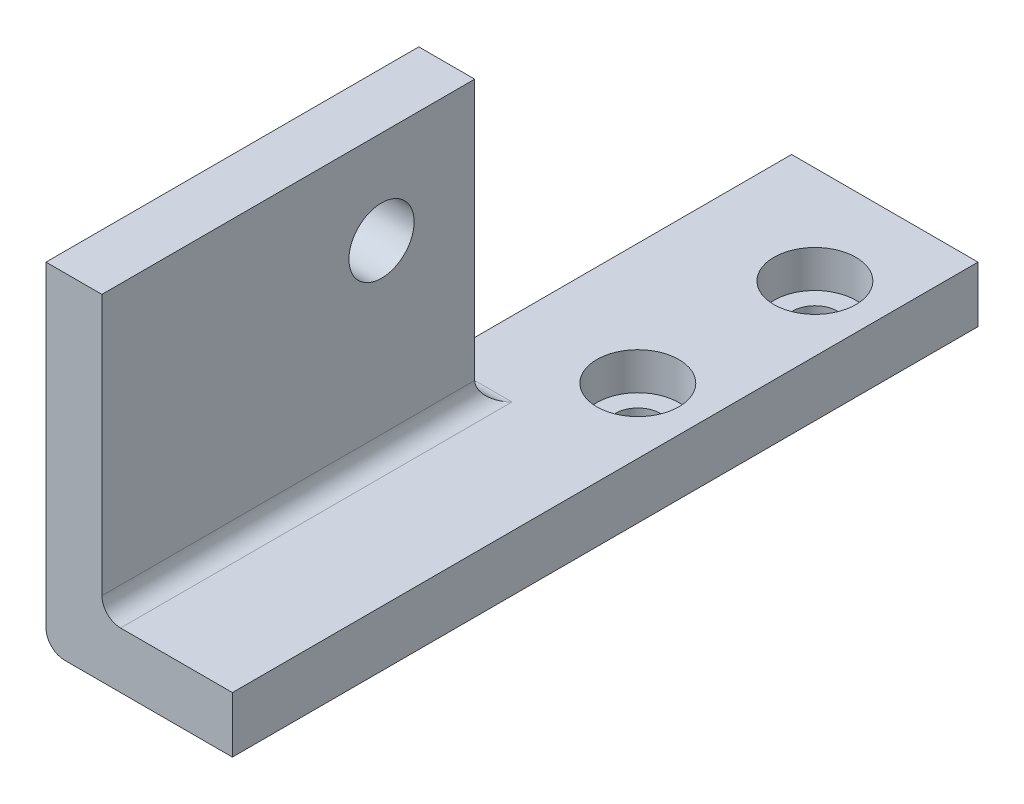
ISO-10303-21;
HEADER;
FILE_DESCRIPTION(('STEP AP214'),'2;1');
FILE_NAME('part.step','',(''),(''),'','','');
FILE_SCHEMA(('AUTOMOTIVE_DESIGN { 1 0 10303 214 1 1 1 1 }'));
ENDSEC;
DATA;
#1=APPLICATION_CONTEXT('core data for automotive mechanical design processes');
#2=APPLICATION_PROTOCOL_DEFINITION('international standard','automotive_design',2000,#1);
#3=PRODUCT_CONTEXT('',#1,'mechanical');
#4=PRODUCT('Part','Part','',(#3));
#5=PRODUCT_RELATED_PRODUCT_CATEGORY('part','',(#4));
#6=PRODUCT_DEFINITION_FORMATION('','',#4);
#7=PRODUCT_DEFINITION_CONTEXT('part definition',#1,'design');
#8=PRODUCT_DEFINITION('design','',#6,#7);
#9=PRODUCT_DEFINITION_SHAPE('','',#8);
#10=(LENGTH_UNIT() NAMED_UNIT(*) SI_UNIT(.MILLI.,.METRE.));
#11=(NAMED_UNIT(*) PLANE_ANGLE_UNIT() SI_UNIT($,.RADIAN.));
#12=(NAMED_UNIT(*) SI_UNIT($,.STERADIAN.) SOLID_ANGLE_UNIT());
#13=UNCERTAINTY_MEASURE_WITH_UNIT(LENGTH_MEASURE(1.E-05),#10,'distance_accuracy_value','');
#14=(GEOMETRIC_REPRESENTATION_CONTEXT(3) GLOBAL_UNCERTAINTY_ASSIGNED_CONTEXT((#13)) GLOBAL_UNIT_ASSIGNED_CONTEXT((#10,
#11,#12)) REPRESENTATION_CONTEXT('',''));
#15=CARTESIAN_POINT('',(0.,0.,0.));
#16=DIRECTION('',(0.,0.,1.));
#17=DIRECTION('',(1.,0.,0.));
#18=AXIS2_PLACEMENT_3D('',#15,#16,#17);
#19=CARTESIAN_POINT('',(0.,3.,0.));
#20=DIRECTION('',(0.,-1.,0.));
#21=DIRECTION('',(0.,0.,-1.));
#22=AXIS2_PLACEMENT_3D('',#19,#20,#21);
#23=PLANE('',#22);
#24=CARTESIAN_POINT('',(6.5,3.,-5.25));
#25=DIRECTION('',(0.,1.,0.));
#26=DIRECTION('',(0.,0.,1.));
#27=AXIS2_PLACEMENT_3D('',#24,#25,#26);
#28=CIRCLE('',#27,2.2);
#29=CARTESIAN_POINT('',(6.5,3.,-3.05));
#30=VERTEX_POINT('',#29);
#31=EDGE_CURVE('E170',#30,#30,#28,.T.);
#32=ORIENTED_EDGE('',*,*,#31,.F.);
#33=EDGE_LOOP('',(#32));
#34=FACE_BOUND('',#33,.T.);
#35=CARTESIAN_POINT('',(6.5,3.,-14.75));
#36=DIRECTION('',(0.,1.,0.));
#37=DIRECTION('',(0.,0.,1.));
#38=AXIS2_PLACEMENT_3D('',#35,#36,#37);
#39=CIRCLE('',#38,2.2);
#40=CARTESIAN_POINT('',(6.5,3.,-12.55));
#41=VERTEX_POINT('',#40);
#42=EDGE_CURVE('E158',#41,#41,#39,.T.);
#43=ORIENTED_EDGE('',*,*,#42,.F.);
#44=EDGE_LOOP('',(#43));
#45=FACE_BOUND('',#44,.T.);
#46=DIRECTION('',(0.,0.,1.));
#47=VECTOR('',#46,1.);
#48=CARTESIAN_POINT('',(0.,3.,0.));
#49=LINE('',#48,#47);
#50=CARTESIAN_POINT('',(0.,3.,-20.));
#51=VERTEX_POINT('',#50);
#52=CARTESIAN_POINT('',(0.,3.,-1.));
#53=VERTEX_POINT('',#52);
#54=EDGE_CURVE('E183',#51,#53,#49,.T.);
#55=ORIENTED_EDGE('',*,*,#54,.T.);
#56=DIRECTION('',(-1.,0.,0.));
#57=VECTOR('',#56,1.);
#58=CARTESIAN_POINT('',(3.,3.,-1.));
#59=LINE('',#58,#57);
#60=CARTESIAN_POINT('',(4.,3.,-1.));
#61=VERTEX_POINT('',#60);
#62=EDGE_CURVE('E203',#53,#61,#59,.F.);
#63=ORIENTED_EDGE('',*,*,#62,.T.);
#64=DIRECTION('',(0.,0.,-1.));
#65=VECTOR('',#64,1.);
#66=CARTESIAN_POINT('',(4.00000000000001,3.,20.));
#67=LINE('',#66,#65);
#68=CARTESIAN_POINT('',(4.00000000000001,3.,20.));
#69=VERTEX_POINT('',#68);
#70=EDGE_CURVE('E201',#61,#69,#67,.F.);
#71=ORIENTED_EDGE('',*,*,#70,.T.);
#72=DIRECTION('',(1.,0.,0.));
#73=VECTOR('',#72,1.);
#74=CARTESIAN_POINT('',(0.,3.,20.));
#75=LINE('',#74,#73);
#76=CARTESIAN_POINT('',(10.,3.,20.));
#77=VERTEX_POINT('',#76);
#78=EDGE_CURVE('E122',#69,#77,#75,.T.);
#79=ORIENTED_EDGE('',*,*,#78,.T.);
#80=DIRECTION('',(0.,0.,-1.));
#81=VECTOR('',#80,1.);
#82=CARTESIAN_POINT('',(10.,3.,0.));
#83=LINE('',#82,#81);
#84=CARTESIAN_POINT('',(10.,3.,-20.));
#85=VERTEX_POINT('',#84);
#86=EDGE_CURVE('E186',#77,#85,#83,.T.);
#87=ORIENTED_EDGE('',*,*,#86,.T.);
#88=DIRECTION('',(-1.,0.,0.));
#89=VECTOR('',#88,1.);
#90=CARTESIAN_POINT('',(0.,3.,-20.));
#91=LINE('',#90,#89);
#92=EDGE_CURVE('E189',#85,#51,#91,.T.);
#93=ORIENTED_EDGE('',*,*,#92,.T.);
#94=EDGE_LOOP('',(#55,#63,#71,#79,#87,#93));
#95=FACE_BOUND('',#94,.T.);
#96=ADVANCED_FACE('F39',(#34,#45,#95),#23,.F.);
#97=CARTESIAN_POINT('',(0.,0.,0.));
#98=DIRECTION('',(0.,-1.,0.));
#99=DIRECTION('',(0.,0.,-1.));
#100=AXIS2_PLACEMENT_3D('',#97,#98,#99);
#101=PLANE('',#100);
#102=CARTESIAN_POINT('',(6.5,0.,-14.75));
#103=DIRECTION('',(0.,1.,0.));
#104=DIRECTION('',(0.,0.,1.));
#105=AXIS2_PLACEMENT_3D('',#102,#103,#104);
#106=CIRCLE('',#105,1.2);
#107=CARTESIAN_POINT('',(6.5,0.,-13.55));
#108=VERTEX_POINT('',#107);
#109=EDGE_CURVE('E167',#108,#108,#106,.T.);
#110=ORIENTED_EDGE('',*,*,#109,.T.);
#111=EDGE_LOOP('',(#110));
#112=FACE_BOUND('',#111,.T.);
#113=CARTESIAN_POINT('',(6.5,0.,-5.25));
#114=DIRECTION('',(0.,1.,0.));
#115=DIRECTION('',(0.,0.,1.));
#116=AXIS2_PLACEMENT_3D('',#113,#114,#115);
#117=CIRCLE('',#116,1.2);
#118=CARTESIAN_POINT('',(6.5,0.,-4.05));
#119=VERTEX_POINT('',#118);
#120=EDGE_CURVE('E179',#119,#119,#117,.T.);
#121=ORIENTED_EDGE('',*,*,#120,.T.);
#122=EDGE_LOOP('',(#121));
#123=FACE_BOUND('',#122,.T.);
#124=DIRECTION('',(-1.,0.,0.));
#125=VECTOR('',#124,1.);
#126=CARTESIAN_POINT('',(0.,0.,20.));
#127=LINE('',#126,#125);
#128=CARTESIAN_POINT('',(10.,0.,20.));
#129=VERTEX_POINT('',#128);
#130=CARTESIAN_POINT('',(1.,0.,20.));
#131=VERTEX_POINT('',#130);
#132=EDGE_CURVE('E156',#129,#131,#127,.T.);
#133=ORIENTED_EDGE('',*,*,#132,.T.);
#134=DIRECTION('',(0.,0.,1.));
#135=VECTOR('',#134,1.);
#136=CARTESIAN_POINT('',(1.,0.,-20.));
#137=LINE('',#136,#135);
#138=CARTESIAN_POINT('',(1.,0.,-20.));
#139=VERTEX_POINT('',#138);
#140=EDGE_CURVE('E47',#131,#139,#137,.F.);
#141=ORIENTED_EDGE('',*,*,#140,.T.);
#142=DIRECTION('',(-1.,0.,0.));
#143=VECTOR('',#142,1.);
#144=CARTESIAN_POINT('',(0.,0.,-20.));
#145=LINE('',#144,#143);
#146=CARTESIAN_POINT('',(10.,0.,-20.));
#147=VERTEX_POINT('',#146);
#148=EDGE_CURVE('E187',#147,#139,#145,.T.);
#149=ORIENTED_EDGE('',*,*,#148,.F.);
#150=DIRECTION('',(0.,0.,-1.));
#151=VECTOR('',#150,1.);
#152=CARTESIAN_POINT('',(10.,0.,0.));
#153=LINE('',#152,#151);
#154=EDGE_CURVE('E182',#129,#147,#153,.T.);
#155=ORIENTED_EDGE('',*,*,#154,.F.);
#156=EDGE_LOOP('',(#133,#141,#149,#155));
#157=FACE_BOUND('',#156,.T.);
#158=ADVANCED_FACE('F254',(#112,#123,#157),#101,.T.);
#159=CARTESIAN_POINT('',(0.,3.,0.));
#160=DIRECTION('',(1.,0.,0.));
#161=DIRECTION('',(0.,0.,-1.));
#162=AXIS2_PLACEMENT_3D('',#159,#160,#161);
#163=PLANE('',#162);
#164=CARTESIAN_POINT('',(0.,13.,5.));
#165=DIRECTION('',(1.,0.,0.));
#166=DIRECTION('',(0.,0.,-1.));
#167=AXIS2_PLACEMENT_3D('',#164,#165,#166);
#168=CIRCLE('',#167,1.75);
#169=CARTESIAN_POINT('',(0.,13.,3.24999999999999));
#170=VERTEX_POINT('',#169);
#171=EDGE_CURVE('E137',#170,#170,#168,.T.);
#172=ORIENTED_EDGE('',*,*,#171,.T.);
#173=EDGE_LOOP('',(#172));
#174=FACE_BOUND('',#173,.T.);
#175=DIRECTION('',(0.,-1.,0.));
#176=VECTOR('',#175,1.);
#177=CARTESIAN_POINT('',(0.,3.,-20.));
#178=LINE('',#177,#176);
#179=CARTESIAN_POINT('',(0.,1.,-20.));
#180=VERTEX_POINT('',#179);
#181=EDGE_CURVE('E191',#51,#180,#178,.T.);
#182=ORIENTED_EDGE('',*,*,#181,.T.);
#183=DIRECTION('',(0.,0.,1.));
#184=VECTOR('',#183,1.);
#185=CARTESIAN_POINT('',(0.,1.,20.));
#186=LINE('',#185,#184);
#187=CARTESIAN_POINT('',(0.,1.,20.));
#188=VERTEX_POINT('',#187);
#189=EDGE_CURVE('E121',#180,#188,#186,.T.);
#190=ORIENTED_EDGE('',*,*,#189,.T.);
#191=DIRECTION('',(0.,1.,0.));
#192=VECTOR('',#191,1.);
#193=CARTESIAN_POINT('',(0.,0.,20.));
#194=LINE('',#193,#192);
#195=CARTESIAN_POINT('',(0.,18.,20.));
#196=VERTEX_POINT('',#195);
#197=EDGE_CURVE('E113',#188,#196,#194,.T.);
#198=ORIENTED_EDGE('',*,*,#197,.T.);
#199=DIRECTION('',(0.,0.,1.));
#200=VECTOR('',#199,1.);
#201=CARTESIAN_POINT('',(0.,18.,20.));
#202=LINE('',#201,#200);
#203=CARTESIAN_POINT('',(0.,18.,0.));
#204=VERTEX_POINT('',#203);
#205=EDGE_CURVE('E119',#204,#196,#202,.T.);
#206=ORIENTED_EDGE('',*,*,#205,.F.);
#207=DIRECTION('',(0.,-1.,0.));
#208=VECTOR('',#207,1.);
#209=CARTESIAN_POINT('',(0.,18.,0.));
#210=LINE('',#209,#208);
#211=CARTESIAN_POINT('',(0.,4.,0.));
#212=VERTEX_POINT('',#211);
#213=EDGE_CURVE('E146',#204,#212,#210,.T.);
#214=ORIENTED_EDGE('',*,*,#213,.T.);
#215=CARTESIAN_POINT('',(0.,4.,-1.));
#216=DIRECTION('',(1.,0.,0.));
#217=DIRECTION('',(0.,0.,-1.));
#218=AXIS2_PLACEMENT_3D('',#215,#216,#217);
#219=CIRCLE('',#218,1.);
#220=EDGE_CURVE('E207',#212,#53,#219,.T.);
#221=ORIENTED_EDGE('',*,*,#220,.T.);
#222=ORIENTED_EDGE('',*,*,#54,.F.);
#223=EDGE_LOOP('',(#182,#190,#198,#206,#214,#221,#222));
#224=FACE_BOUND('',#223,.T.);
#225=ADVANCED_FACE('F116',(#174,#224),#163,.F.);
#226=CARTESIAN_POINT('',(10.,3.,0.));
#227=DIRECTION('',(-1.,0.,0.));
#228=DIRECTION('',(0.,0.,1.));
#229=AXIS2_PLACEMENT_3D('',#226,#227,#228);
#230=PLANE('',#229);
#231=ORIENTED_EDGE('',*,*,#154,.T.);
#232=DIRECTION('',(0.,-1.,0.));
#233=VECTOR('',#232,1.);
#234=CARTESIAN_POINT('',(10.,3.,-20.));
#235=LINE('',#234,#233);
#236=EDGE_CURVE('E195',#85,#147,#235,.T.);
#237=ORIENTED_EDGE('',*,*,#236,.F.);
#238=ORIENTED_EDGE('',*,*,#86,.F.);
#239=DIRECTION('',(0.,-1.,0.));
#240=VECTOR('',#239,1.);
#241=CARTESIAN_POINT('',(10.,0.,20.));
#242=LINE('',#241,#240);
#243=EDGE_CURVE('E153',#77,#129,#242,.T.);
#244=ORIENTED_EDGE('',*,*,#243,.T.);
#245=EDGE_LOOP('',(#231,#237,#238,#244));
#246=FACE_BOUND('',#245,.T.);
#247=ADVANCED_FACE('F271',(#246),#230,.F.);
#248=CARTESIAN_POINT('',(0.,3.,-20.));
#249=DIRECTION('',(0.,0.,1.));
#250=DIRECTION('',(1.,0.,0.));
#251=AXIS2_PLACEMENT_3D('',#248,#249,#250);
#252=PLANE('',#251);
#253=ORIENTED_EDGE('',*,*,#148,.T.);
#254=CARTESIAN_POINT('',(1.,1.,-20.));
#255=DIRECTION('',(0.,0.,1.));
#256=DIRECTION('',(1.,0.,0.));
#257=AXIS2_PLACEMENT_3D('',#254,#255,#256);
#258=CIRCLE('',#257,1.);
#259=EDGE_CURVE('E11',#139,#180,#258,.F.);
#260=ORIENTED_EDGE('',*,*,#259,.T.);
#261=ORIENTED_EDGE('',*,*,#181,.F.);
#262=ORIENTED_EDGE('',*,*,#92,.F.);
#263=ORIENTED_EDGE('',*,*,#236,.T.);
#264=EDGE_LOOP('',(#253,#260,#261,#262,#263));
#265=FACE_BOUND('',#264,.T.);
#266=ADVANCED_FACE('F244',(#265),#252,.F.);
#267=CARTESIAN_POINT('',(6.5,3.,-5.25));
#268=DIRECTION('',(0.,1.,0.));
#269=DIRECTION('',(0.,0.,1.));
#270=AXIS2_PLACEMENT_3D('',#267,#268,#269);
#271=CYLINDRICAL_SURFACE('',#270,1.2);
#272=ORIENTED_EDGE('',*,*,#120,.F.);
#273=EDGE_LOOP('',(#272));
#274=FACE_BOUND('',#273,.T.);
#275=CARTESIAN_POINT('',(6.5,1.,-5.25));
#276=DIRECTION('',(0.,1.,0.));
#277=DIRECTION('',(0.,0.,1.));
#278=AXIS2_PLACEMENT_3D('',#275,#276,#277);
#279=CIRCLE('',#278,1.2);
#280=CARTESIAN_POINT('',(6.5,1.,-4.05));
#281=VERTEX_POINT('',#280);
#282=EDGE_CURVE('E176',#281,#281,#279,.T.);
#283=ORIENTED_EDGE('',*,*,#282,.T.);
#284=EDGE_LOOP('',(#283));
#285=FACE_BOUND('',#284,.T.);
#286=ADVANCED_FACE('F266',(#274,#285),#271,.F.);
#287=CARTESIAN_POINT('',(7.7,1.,-5.25));
#288=DIRECTION('',(0.,-1.,0.));
#289=DIRECTION('',(0.,0.,-1.));
#290=AXIS2_PLACEMENT_3D('',#287,#288,#289);
#291=PLANE('',#290);
#292=ORIENTED_EDGE('',*,*,#282,.F.);
#293=EDGE_LOOP('',(#292));
#294=FACE_BOUND('',#293,.T.);
#295=CARTESIAN_POINT('',(6.5,1.,-5.25));
#296=DIRECTION('',(0.,1.,0.));
#297=DIRECTION('',(0.,0.,1.));
#298=AXIS2_PLACEMENT_3D('',#295,#296,#297);
#299=CIRCLE('',#298,2.2);
#300=CARTESIAN_POINT('',(6.5,1.,-3.05));
#301=VERTEX_POINT('',#300);
#302=EDGE_CURVE('E173',#301,#301,#299,.T.);
#303=ORIENTED_EDGE('',*,*,#302,.T.);
#304=EDGE_LOOP('',(#303));
#305=FACE_BOUND('',#304,.T.);
#306=ADVANCED_FACE('F305',(#294,#305),#291,.F.);
#307=CARTESIAN_POINT('',(6.5,3.,-5.25));
#308=DIRECTION('',(0.,1.,0.));
#309=DIRECTION('',(0.,0.,1.));
#310=AXIS2_PLACEMENT_3D('',#307,#308,#309);
#311=CYLINDRICAL_SURFACE('',#310,2.2);
#312=ORIENTED_EDGE('',*,*,#302,.F.);
#313=EDGE_LOOP('',(#312));
#314=FACE_BOUND('',#313,.T.);
#315=ORIENTED_EDGE('',*,*,#31,.T.);
#316=EDGE_LOOP('',(#315));
#317=FACE_BOUND('',#316,.T.);
#318=ADVANCED_FACE('F302',(#314,#317),#311,.F.);
#319=CARTESIAN_POINT('',(6.5,3.,-14.75));
#320=DIRECTION('',(0.,1.,0.));
#321=DIRECTION('',(0.,0.,1.));
#322=AXIS2_PLACEMENT_3D('',#319,#320,#321);
#323=CYLINDRICAL_SURFACE('',#322,1.2);
#324=ORIENTED_EDGE('',*,*,#109,.F.);
#325=EDGE_LOOP('',(#324));
#326=FACE_BOUND('',#325,.T.);
#327=CARTESIAN_POINT('',(6.5,1.,-14.75));
#328=DIRECTION('',(0.,1.,0.));
#329=DIRECTION('',(0.,0.,1.));
#330=AXIS2_PLACEMENT_3D('',#327,#328,#329);
#331=CIRCLE('',#330,1.2);
#332=CARTESIAN_POINT('',(6.5,1.,-13.55));
#333=VERTEX_POINT('',#332);
#334=EDGE_CURVE('E164',#333,#333,#331,.T.);
#335=ORIENTED_EDGE('',*,*,#334,.T.);
#336=EDGE_LOOP('',(#335));
#337=FACE_BOUND('',#336,.T.);
#338=ADVANCED_FACE('F298',(#326,#337),#323,.F.);
#339=CARTESIAN_POINT('',(7.7,1.,-14.75));
#340=DIRECTION('',(0.,-1.,0.));
#341=DIRECTION('',(0.,0.,-1.));
#342=AXIS2_PLACEMENT_3D('',#339,#340,#341);
#343=PLANE('',#342);
#344=ORIENTED_EDGE('',*,*,#334,.F.);
#345=EDGE_LOOP('',(#344));
#346=FACE_BOUND('',#345,.T.);
#347=CARTESIAN_POINT('',(6.5,1.,-14.75));
#348=DIRECTION('',(0.,1.,0.));
#349=DIRECTION('',(0.,0.,1.));
#350=AXIS2_PLACEMENT_3D('',#347,#348,#349);
#351=CIRCLE('',#350,2.2);
#352=CARTESIAN_POINT('',(6.5,1.,-12.55));
#353=VERTEX_POINT('',#352);
#354=EDGE_CURVE('E161',#353,#353,#351,.T.);
#355=ORIENTED_EDGE('',*,*,#354,.T.);
#356=EDGE_LOOP('',(#355));
#357=FACE_BOUND('',#356,.T.);
#358=ADVANCED_FACE('F294',(#346,#357),#343,.F.);
#359=CARTESIAN_POINT('',(6.5,3.,-14.75));
#360=DIRECTION('',(0.,1.,0.));
#361=DIRECTION('',(0.,0.,1.));
#362=AXIS2_PLACEMENT_3D('',#359,#360,#361);
#363=CYLINDRICAL_SURFACE('',#362,2.2);
#364=ORIENTED_EDGE('',*,*,#354,.F.);
#365=EDGE_LOOP('',(#364));
#366=FACE_BOUND('',#365,.T.);
#367=ORIENTED_EDGE('',*,*,#42,.T.);
#368=EDGE_LOOP('',(#367));
#369=FACE_BOUND('',#368,.T.);
#370=ADVANCED_FACE('F291',(#366,#369),#363,.F.);
#371=CARTESIAN_POINT('',(0.,0.,20.));
#372=DIRECTION('',(0.,0.,-1.));
#373=DIRECTION('',(-1.,0.,0.));
#374=AXIS2_PLACEMENT_3D('',#371,#372,#373);
#375=PLANE('',#374);
#376=ORIENTED_EDGE('',*,*,#197,.F.);
#377=CARTESIAN_POINT('',(1.,1.,20.));
#378=DIRECTION('',(0.,0.,-1.));
#379=DIRECTION('',(-1.,0.,0.));
#380=AXIS2_PLACEMENT_3D('',#377,#378,#379);
#381=CIRCLE('',#380,1.);
#382=EDGE_CURVE('E61',#188,#131,#381,.F.);
#383=ORIENTED_EDGE('',*,*,#382,.T.);
#384=ORIENTED_EDGE('',*,*,#132,.F.);
#385=ORIENTED_EDGE('',*,*,#243,.F.);
#386=ORIENTED_EDGE('',*,*,#78,.F.);
#387=CARTESIAN_POINT('',(4.00000000000001,4.,20.));
#388=DIRECTION('',(0.,0.,-1.));
#389=DIRECTION('',(-1.,0.,0.));
#390=AXIS2_PLACEMENT_3D('',#387,#388,#389);
#391=CIRCLE('',#390,1.);
#392=CARTESIAN_POINT('',(3.00000000000001,4.,20.));
#393=VERTEX_POINT('',#392);
#394=EDGE_CURVE('E209',#69,#393,#391,.T.);
#395=ORIENTED_EDGE('',*,*,#394,.T.);
#396=DIRECTION('',(0.,-1.,0.));
#397=VECTOR('',#396,1.);
#398=CARTESIAN_POINT('',(3.00000000000001,18.,20.));
#399=LINE('',#398,#397);
#400=CARTESIAN_POINT('',(3.00000000000001,18.,20.));
#401=VERTEX_POINT('',#400);
#402=EDGE_CURVE('E123',#401,#393,#399,.T.);
#403=ORIENTED_EDGE('',*,*,#402,.F.);
#404=DIRECTION('',(1.,0.,0.));
#405=VECTOR('',#404,1.);
#406=CARTESIAN_POINT('',(0.,18.,20.));
#407=LINE('',#406,#405);
#408=EDGE_CURVE('E126',#196,#401,#407,.T.);
#409=ORIENTED_EDGE('',*,*,#408,.F.);
#410=EDGE_LOOP('',(#376,#383,#384,#385,#386,#395,#403,#409));
#411=FACE_BOUND('',#410,.T.);
#412=ADVANCED_FACE('F127',(#411),#375,.F.);
#413=CARTESIAN_POINT('',(3.00000000000001,18.,20.));
#414=DIRECTION('',(-1.,0.,0.));
#415=DIRECTION('',(0.,0.,1.));
#416=AXIS2_PLACEMENT_3D('',#413,#414,#415);
#417=PLANE('',#416);
#418=CARTESIAN_POINT('',(3.,13.,5.));
#419=DIRECTION('',(1.,0.,0.));
#420=DIRECTION('',(0.,0.,-1.));
#421=AXIS2_PLACEMENT_3D('',#418,#419,#420);
#422=CIRCLE('',#421,1.75);
#423=CARTESIAN_POINT('',(3.,13.,3.24999999999999));
#424=VERTEX_POINT('',#423);
#425=EDGE_CURVE('E140',#424,#424,#422,.T.);
#426=ORIENTED_EDGE('',*,*,#425,.F.);
#427=EDGE_LOOP('',(#426));
#428=FACE_BOUND('',#427,.T.);
#429=ORIENTED_EDGE('',*,*,#402,.T.);
#430=DIRECTION('',(0.,0.,-1.));
#431=VECTOR('',#430,1.);
#432=CARTESIAN_POINT('',(3.,4.,0.));
#433=LINE('',#432,#431);
#434=CARTESIAN_POINT('',(3.,4.,0.));
#435=VERTEX_POINT('',#434);
#436=EDGE_CURVE('E205',#393,#435,#433,.T.);
#437=ORIENTED_EDGE('',*,*,#436,.T.);
#438=DIRECTION('',(0.,-1.,0.));
#439=VECTOR('',#438,1.);
#440=CARTESIAN_POINT('',(3.,18.,0.));
#441=LINE('',#440,#439);
#442=CARTESIAN_POINT('',(3.,18.,0.));
#443=VERTEX_POINT('',#442);
#444=EDGE_CURVE('E148',#443,#435,#441,.T.);
#445=ORIENTED_EDGE('',*,*,#444,.F.);
#446=DIRECTION('',(0.,0.,-1.));
#447=VECTOR('',#446,1.);
#448=CARTESIAN_POINT('',(3.00000000000001,18.,20.));
#449=LINE('',#448,#447);
#450=EDGE_CURVE('E131',#401,#443,#449,.T.);
#451=ORIENTED_EDGE('',*,*,#450,.F.);
#452=EDGE_LOOP('',(#429,#437,#445,#451));
#453=FACE_BOUND('',#452,.T.);
#454=ADVANCED_FACE('F224',(#428,#453),#417,.F.);
#455=CARTESIAN_POINT('',(0.,18.,0.));
#456=DIRECTION('',(0.,0.,1.));
#457=DIRECTION('',(1.,0.,0.));
#458=AXIS2_PLACEMENT_3D('',#455,#456,#457);
#459=PLANE('',#458);
#460=ORIENTED_EDGE('',*,*,#444,.T.);
#461=DIRECTION('',(-1.,0.,0.));
#462=VECTOR('',#461,1.);
#463=CARTESIAN_POINT('',(0.,4.,0.));
#464=LINE('',#463,#462);
#465=EDGE_CURVE('E198',#435,#212,#464,.T.);
#466=ORIENTED_EDGE('',*,*,#465,.T.);
#467=ORIENTED_EDGE('',*,*,#213,.F.);
#468=DIRECTION('',(-1.,0.,0.));
#469=VECTOR('',#468,1.);
#470=CARTESIAN_POINT('',(0.,18.,0.));
#471=LINE('',#470,#469);
#472=EDGE_CURVE('E135',#443,#204,#471,.T.);
#473=ORIENTED_EDGE('',*,*,#472,.F.);
#474=EDGE_LOOP('',(#460,#466,#467,#473));
#475=FACE_BOUND('',#474,.T.);
#476=ADVANCED_FACE('F227',(#475),#459,.F.);
#477=CARTESIAN_POINT('',(0.,18.,0.));
#478=DIRECTION('',(0.,-1.,0.));
#479=DIRECTION('',(0.,0.,-1.));
#480=AXIS2_PLACEMENT_3D('',#477,#478,#479);
#481=PLANE('',#480);
#482=ORIENTED_EDGE('',*,*,#205,.T.);
#483=ORIENTED_EDGE('',*,*,#408,.T.);
#484=ORIENTED_EDGE('',*,*,#450,.T.);
#485=ORIENTED_EDGE('',*,*,#472,.T.);
#486=EDGE_LOOP('',(#482,#483,#484,#485));
#487=FACE_BOUND('',#486,.T.);
#488=ADVANCED_FACE('F133',(#487),#481,.F.);
#489=CARTESIAN_POINT('',(0.,13.,5.));
#490=DIRECTION('',(1.,0.,0.));
#491=DIRECTION('',(0.,0.,-1.));
#492=AXIS2_PLACEMENT_3D('',#489,#490,#491);
#493=CYLINDRICAL_SURFACE('',#492,1.75);
#494=ORIENTED_EDGE('',*,*,#171,.F.);
#495=EDGE_LOOP('',(#494));
#496=FACE_BOUND('',#495,.T.);
#497=ORIENTED_EDGE('',*,*,#425,.T.);
#498=EDGE_LOOP('',(#497));
#499=FACE_BOUND('',#498,.T.);
#500=ADVANCED_FACE('F222',(#496,#499),#493,.F.);
#501=CARTESIAN_POINT('',(4.00000000000001,4.,20.));
#502=DIRECTION('',(0.,0.,1.));
#503=DIRECTION('',(1.,0.,0.));
#504=AXIS2_PLACEMENT_3D('',#501,#502,#503);
#505=CYLINDRICAL_SURFACE('',#504,1.);
#506=ORIENTED_EDGE('',*,*,#394,.F.);
#507=ORIENTED_EDGE('',*,*,#70,.F.);
#508=CARTESIAN_POINT('',(4.,4.,-1.));
#509=DIRECTION('',(0.707106781186548,0.,0.707106781186547));
#510=DIRECTION('',(-0.707106781186547,0.,0.707106781186548));
#511=AXIS2_PLACEMENT_3D('',#508,#509,#510);
#512=ELLIPSE('',#511,1.41421356237309,1.);
#513=EDGE_CURVE('E211',#435,#61,#512,.T.);
#514=ORIENTED_EDGE('',*,*,#513,.F.);
#515=ORIENTED_EDGE('',*,*,#436,.F.);
#516=EDGE_LOOP('',(#506,#507,#514,#515));
#517=FACE_BOUND('',#516,.T.);
#518=ADVANCED_FACE('F233',(#517),#505,.F.);
#519=CARTESIAN_POINT('',(0.,4.,-1.));
#520=DIRECTION('',(1.,0.,0.));
#521=DIRECTION('',(0.,0.,-1.));
#522=AXIS2_PLACEMENT_3D('',#519,#520,#521);
#523=CYLINDRICAL_SURFACE('',#522,1.);
#524=ORIENTED_EDGE('',*,*,#513,.T.);
#525=ORIENTED_EDGE('',*,*,#62,.F.);
#526=ORIENTED_EDGE('',*,*,#220,.F.);
#527=ORIENTED_EDGE('',*,*,#465,.F.);
#528=EDGE_LOOP('',(#524,#525,#526,#527));
#529=FACE_BOUND('',#528,.T.);
#530=ADVANCED_FACE('F235',(#529),#523,.F.);
#531=CARTESIAN_POINT('',(1.,1.,0.));
#532=DIRECTION('',(0.,0.,-1.));
#533=DIRECTION('',(-1.,0.,0.));
#534=AXIS2_PLACEMENT_3D('',#531,#532,#533);
#535=CYLINDRICAL_SURFACE('',#534,1.);
#536=ORIENTED_EDGE('',*,*,#259,.F.);
#537=ORIENTED_EDGE('',*,*,#140,.F.);
#538=ORIENTED_EDGE('',*,*,#382,.F.);
#539=ORIENTED_EDGE('',*,*,#189,.F.);
#540=EDGE_LOOP('',(#536,#537,#538,#539));
#541=FACE_BOUND('',#540,.T.);
#542=ADVANCED_FACE('F41',(#541),#535,.T.);
#543=CLOSED_SHELL('',(#96,#158,#225,#247,#266,#286,#306,#318,#338,#358,#370,#412,#454,#476,#488,
#500,#518,#530,#542));
#544=MANIFOLD_SOLID_BREP('B2',#543);
#545=ADVANCED_BREP_SHAPE_REPRESENTATION('',(#18,#544),#14);
#546=SHAPE_DEFINITION_REPRESENTATION(#9,#545);
ENDSEC;
END-ISO-10303-21;
